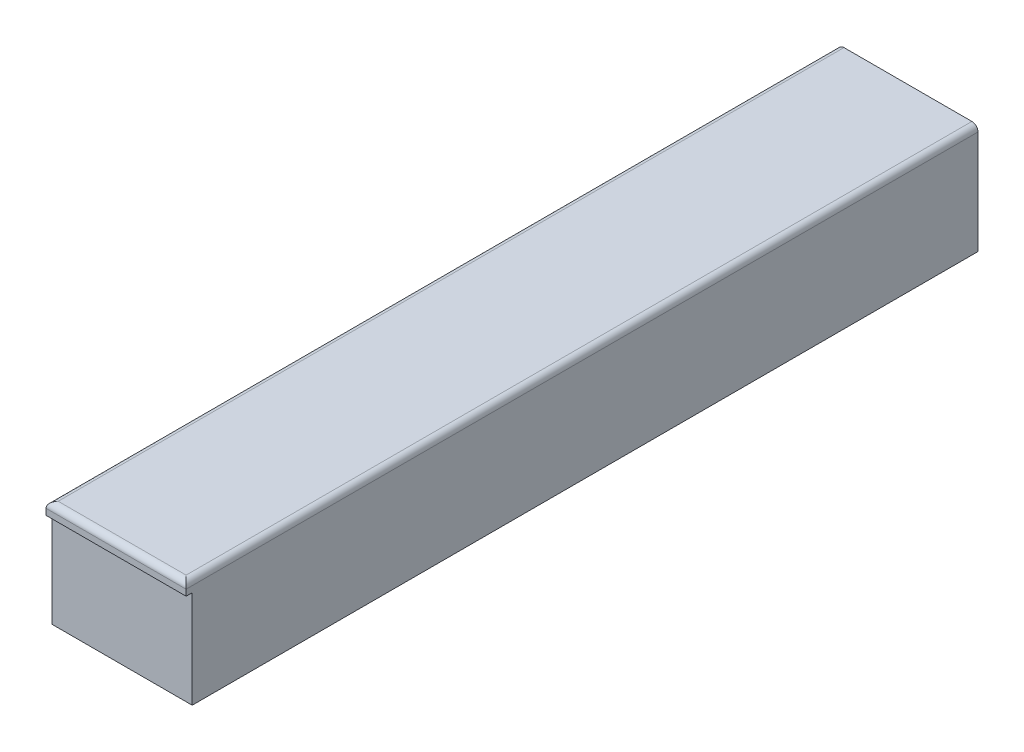
ISO-10303-21;
HEADER;
FILE_DESCRIPTION(('STEP AP214'),'2;1');
FILE_NAME('part.step','',(''),(''),'','','');
FILE_SCHEMA(('AUTOMOTIVE_DESIGN { 1 0 10303 214 1 1 1 1 }'));
ENDSEC;
DATA;
#1=APPLICATION_CONTEXT('core data for automotive mechanical design processes');
#2=APPLICATION_PROTOCOL_DEFINITION('international standard','automotive_design',2000,#1);
#3=PRODUCT_CONTEXT('',#1,'mechanical');
#4=PRODUCT('Part','Part','',(#3));
#5=PRODUCT_RELATED_PRODUCT_CATEGORY('part','',(#4));
#6=PRODUCT_DEFINITION_FORMATION('','',#4);
#7=PRODUCT_DEFINITION_CONTEXT('part definition',#1,'design');
#8=PRODUCT_DEFINITION('design','',#6,#7);
#9=PRODUCT_DEFINITION_SHAPE('','',#8);
#10=(LENGTH_UNIT() NAMED_UNIT(*) SI_UNIT(.MILLI.,.METRE.));
#11=(NAMED_UNIT(*) PLANE_ANGLE_UNIT() SI_UNIT($,.RADIAN.));
#12=(NAMED_UNIT(*) SI_UNIT($,.STERADIAN.) SOLID_ANGLE_UNIT());
#13=UNCERTAINTY_MEASURE_WITH_UNIT(LENGTH_MEASURE(1.E-05),#10,'distance_accuracy_value','');
#14=(GEOMETRIC_REPRESENTATION_CONTEXT(3) GLOBAL_UNCERTAINTY_ASSIGNED_CONTEXT((#13)) GLOBAL_UNIT_ASSIGNED_CONTEXT((#10,
#11,#12)) REPRESENTATION_CONTEXT('',''));
#15=CARTESIAN_POINT('',(0.,0.,0.));
#16=DIRECTION('',(0.,0.,1.));
#17=DIRECTION('',(1.,0.,0.));
#18=AXIS2_PLACEMENT_3D('',#15,#16,#17);
#19=CARTESIAN_POINT('',(0.,18.,0.));
#20=DIRECTION('',(0.,0.,-1.));
#21=DIRECTION('',(-1.,0.,0.));
#22=AXIS2_PLACEMENT_3D('',#19,#20,#21);
#23=PLANE('',#22);
#24=DIRECTION('',(0.,-1.,0.));
#25=VECTOR('',#24,1.);
#26=CARTESIAN_POINT('',(23.,18.,0.));
#27=LINE('',#26,#25);
#28=CARTESIAN_POINT('',(23.,17.,0.));
#29=VERTEX_POINT('',#28);
#30=CARTESIAN_POINT('',(23.,16.,0.));
#31=VERTEX_POINT('',#30);
#32=EDGE_CURVE('E142',#29,#31,#27,.T.);
#33=ORIENTED_EDGE('',*,*,#32,.F.);
#34=DIRECTION('',(1.,0.,0.));
#35=VECTOR('',#34,1.);
#36=CARTESIAN_POINT('',(0.,17.,0.));
#37=LINE('',#36,#35);
#38=CARTESIAN_POINT('',(0.,17.,0.));
#39=VERTEX_POINT('',#38);
#40=EDGE_CURVE('E11',#29,#39,#37,.F.);
#41=ORIENTED_EDGE('',*,*,#40,.T.);
#42=DIRECTION('',(0.,-1.,0.));
#43=VECTOR('',#42,1.);
#44=CARTESIAN_POINT('',(0.,18.,0.));
#45=LINE('',#44,#43);
#46=CARTESIAN_POINT('',(0.,16.,0.));
#47=VERTEX_POINT('',#46);
#48=EDGE_CURVE('E136',#39,#47,#45,.T.);
#49=ORIENTED_EDGE('',*,*,#48,.T.);
#50=DIRECTION('',(-1.,0.,0.));
#51=VECTOR('',#50,1.);
#52=CARTESIAN_POINT('',(0.,16.,0.));
#53=LINE('',#52,#51);
#54=EDGE_CURVE('E162',#31,#47,#53,.T.);
#55=ORIENTED_EDGE('',*,*,#54,.F.);
#56=EDGE_LOOP('',(#33,#41,#49,#55));
#57=FACE_BOUND('',#56,.T.);
#58=ADVANCED_FACE('F35',(#57),#23,.F.);
#59=CARTESIAN_POINT('',(23.,18.,0.));
#60=DIRECTION('',(-1.,0.,0.));
#61=DIRECTION('',(0.,0.,1.));
#62=AXIS2_PLACEMENT_3D('',#59,#60,#61);
#63=PLANE('',#62);
#64=DIRECTION('',(0.,-1.,0.));
#65=VECTOR('',#64,1.);
#66=CARTESIAN_POINT('',(23.,18.,-130.));
#67=LINE('',#66,#65);
#68=CARTESIAN_POINT('',(23.,17.,-130.));
#69=VERTEX_POINT('',#68);
#70=CARTESIAN_POINT('',(23.,0.,-130.));
#71=VERTEX_POINT('',#70);
#72=EDGE_CURVE('E140',#69,#71,#67,.T.);
#73=ORIENTED_EDGE('',*,*,#72,.F.);
#74=DIRECTION('',(0.,0.,-1.));
#75=VECTOR('',#74,1.);
#76=CARTESIAN_POINT('',(23.,17.,0.));
#77=LINE('',#76,#75);
#78=EDGE_CURVE('E58',#69,#29,#77,.F.);
#79=ORIENTED_EDGE('',*,*,#78,.T.);
#80=ORIENTED_EDGE('',*,*,#32,.T.);
#81=DIRECTION('',(0.,0.,1.));
#82=VECTOR('',#81,1.);
#83=CARTESIAN_POINT('',(23.,16.,-1.));
#84=LINE('',#83,#82);
#85=CARTESIAN_POINT('',(23.,16.,-1.));
#86=VERTEX_POINT('',#85);
#87=EDGE_CURVE('E119',#86,#31,#84,.T.);
#88=ORIENTED_EDGE('',*,*,#87,.F.);
#89=DIRECTION('',(0.,1.,0.));
#90=VECTOR('',#89,1.);
#91=CARTESIAN_POINT('',(23.,0.,-1.));
#92=LINE('',#91,#90);
#93=CARTESIAN_POINT('',(23.,0.,-1.));
#94=VERTEX_POINT('',#93);
#95=EDGE_CURVE('E104',#94,#86,#92,.T.);
#96=ORIENTED_EDGE('',*,*,#95,.F.);
#97=DIRECTION('',(0.,0.,-1.));
#98=VECTOR('',#97,1.);
#99=CARTESIAN_POINT('',(23.,0.,0.));
#100=LINE('',#99,#98);
#101=EDGE_CURVE('E116',#94,#71,#100,.T.);
#102=ORIENTED_EDGE('',*,*,#101,.T.);
#103=EDGE_LOOP('',(#73,#79,#80,#88,#96,#102));
#104=FACE_BOUND('',#103,.T.);
#105=ADVANCED_FACE('F115',(#104),#63,.F.);
#106=CARTESIAN_POINT('',(0.,18.,-130.));
#107=DIRECTION('',(0.,0.,-1.));
#108=DIRECTION('',(-1.,0.,0.));
#109=AXIS2_PLACEMENT_3D('',#106,#107,#108);
#110=PLANE('',#109);
#111=DIRECTION('',(1.,0.,0.));
#112=VECTOR('',#111,1.);
#113=CARTESIAN_POINT('',(0.,18.,-130.));
#114=LINE('',#113,#112);
#115=CARTESIAN_POINT('',(0.999999999999976,18.,-130.));
#116=VERTEX_POINT('',#115);
#117=CARTESIAN_POINT('',(22.,18.,-130.));
#118=VERTEX_POINT('',#117);
#119=EDGE_CURVE('E132',#116,#118,#114,.T.);
#120=ORIENTED_EDGE('',*,*,#119,.T.);
#121=CARTESIAN_POINT('',(22.,17.,-130.));
#122=DIRECTION('',(0.,0.,-1.));
#123=DIRECTION('',(-1.,0.,0.));
#124=AXIS2_PLACEMENT_3D('',#121,#122,#123);
#125=CIRCLE('',#124,1.);
#126=EDGE_CURVE('E153',#118,#69,#125,.T.);
#127=ORIENTED_EDGE('',*,*,#126,.T.);
#128=ORIENTED_EDGE('',*,*,#72,.T.);
#129=DIRECTION('',(1.,0.,0.));
#130=VECTOR('',#129,1.);
#131=CARTESIAN_POINT('',(0.,0.,-130.));
#132=LINE('',#131,#130);
#133=CARTESIAN_POINT('',(0.,0.,-130.));
#134=VERTEX_POINT('',#133);
#135=EDGE_CURVE('E124',#134,#71,#132,.T.);
#136=ORIENTED_EDGE('',*,*,#135,.F.);
#137=DIRECTION('',(0.,-1.,0.));
#138=VECTOR('',#137,1.);
#139=CARTESIAN_POINT('',(0.,18.,-130.));
#140=LINE('',#139,#138);
#141=CARTESIAN_POINT('',(0.,17.,-130.));
#142=VERTEX_POINT('',#141);
#143=EDGE_CURVE('E138',#142,#134,#140,.T.);
#144=ORIENTED_EDGE('',*,*,#143,.F.);
#145=CARTESIAN_POINT('',(0.999999999999976,17.,-130.));
#146=DIRECTION('',(0.,0.,-1.));
#147=DIRECTION('',(-1.,0.,0.));
#148=AXIS2_PLACEMENT_3D('',#145,#146,#147);
#149=CIRCLE('',#148,1.);
#150=EDGE_CURVE('E151',#142,#116,#149,.T.);
#151=ORIENTED_EDGE('',*,*,#150,.T.);
#152=EDGE_LOOP('',(#120,#127,#128,#136,#144,#151));
#153=FACE_BOUND('',#152,.T.);
#154=ADVANCED_FACE('F177',(#153),#110,.T.);
#155=CARTESIAN_POINT('',(0.,18.,0.));
#156=DIRECTION('',(-1.,0.,0.));
#157=DIRECTION('',(0.,0.,1.));
#158=AXIS2_PLACEMENT_3D('',#155,#156,#157);
#159=PLANE('',#158);
#160=ORIENTED_EDGE('',*,*,#48,.F.);
#161=DIRECTION('',(0.,0.,-1.));
#162=VECTOR('',#161,1.);
#163=CARTESIAN_POINT('',(0.,17.,0.));
#164=LINE('',#163,#162);
#165=EDGE_CURVE('E44',#39,#142,#164,.T.);
#166=ORIENTED_EDGE('',*,*,#165,.T.);
#167=ORIENTED_EDGE('',*,*,#143,.T.);
#168=DIRECTION('',(0.,0.,-1.));
#169=VECTOR('',#168,1.);
#170=CARTESIAN_POINT('',(0.,0.,0.));
#171=LINE('',#170,#169);
#172=CARTESIAN_POINT('',(0.,0.,-1.));
#173=VERTEX_POINT('',#172);
#174=EDGE_CURVE('E127',#173,#134,#171,.T.);
#175=ORIENTED_EDGE('',*,*,#174,.F.);
#176=DIRECTION('',(0.,-1.,0.));
#177=VECTOR('',#176,1.);
#178=CARTESIAN_POINT('',(0.,0.,-1.));
#179=LINE('',#178,#177);
#180=CARTESIAN_POINT('',(0.,16.,-1.));
#181=VERTEX_POINT('',#180);
#182=EDGE_CURVE('E107',#181,#173,#179,.T.);
#183=ORIENTED_EDGE('',*,*,#182,.F.);
#184=DIRECTION('',(0.,0.,1.));
#185=VECTOR('',#184,1.);
#186=CARTESIAN_POINT('',(0.,16.,-1.));
#187=LINE('',#186,#185);
#188=EDGE_CURVE('E125',#181,#47,#187,.T.);
#189=ORIENTED_EDGE('',*,*,#188,.T.);
#190=EDGE_LOOP('',(#160,#166,#167,#175,#183,#189));
#191=FACE_BOUND('',#190,.T.);
#192=ADVANCED_FACE('F173',(#191),#159,.T.);
#193=CARTESIAN_POINT('',(0.,18.,0.));
#194=DIRECTION('',(0.,1.,0.));
#195=DIRECTION('',(0.,0.,1.));
#196=AXIS2_PLACEMENT_3D('',#193,#194,#195);
#197=PLANE('',#196);
#198=DIRECTION('',(1.,0.,0.));
#199=VECTOR('',#198,1.);
#200=CARTESIAN_POINT('',(23.,18.,-1.));
#201=LINE('',#200,#199);
#202=CARTESIAN_POINT('',(1.,18.,-1.));
#203=VERTEX_POINT('',#202);
#204=CARTESIAN_POINT('',(22.,18.,-1.));
#205=VERTEX_POINT('',#204);
#206=EDGE_CURVE('E144',#203,#205,#201,.T.);
#207=ORIENTED_EDGE('',*,*,#206,.T.);
#208=DIRECTION('',(0.,0.,-1.));
#209=VECTOR('',#208,1.);
#210=CARTESIAN_POINT('',(22.,18.,-130.));
#211=LINE('',#210,#209);
#212=EDGE_CURVE('E148',#205,#118,#211,.T.);
#213=ORIENTED_EDGE('',*,*,#212,.T.);
#214=ORIENTED_EDGE('',*,*,#119,.F.);
#215=DIRECTION('',(0.,0.,-1.));
#216=VECTOR('',#215,1.);
#217=CARTESIAN_POINT('',(1.,18.,0.));
#218=LINE('',#217,#216);
#219=EDGE_CURVE('E146',#116,#203,#218,.F.);
#220=ORIENTED_EDGE('',*,*,#219,.T.);
#221=EDGE_LOOP('',(#207,#213,#214,#220));
#222=FACE_BOUND('',#221,.T.);
#223=ADVANCED_FACE('F182',(#222),#197,.T.);
#224=CARTESIAN_POINT('',(0.,0.,0.));
#225=DIRECTION('',(0.,1.,0.));
#226=DIRECTION('',(0.,0.,1.));
#227=AXIS2_PLACEMENT_3D('',#224,#225,#226);
#228=PLANE('',#227);
#229=ORIENTED_EDGE('',*,*,#101,.F.);
#230=DIRECTION('',(1.,0.,0.));
#231=VECTOR('',#230,1.);
#232=CARTESIAN_POINT('',(0.,0.,-1.));
#233=LINE('',#232,#231);
#234=EDGE_CURVE('E100',#173,#94,#233,.T.);
#235=ORIENTED_EDGE('',*,*,#234,.F.);
#236=ORIENTED_EDGE('',*,*,#174,.T.);
#237=ORIENTED_EDGE('',*,*,#135,.T.);
#238=EDGE_LOOP('',(#229,#235,#236,#237));
#239=FACE_BOUND('',#238,.T.);
#240=ADVANCED_FACE('F122',(#239),#228,.F.);
#241=CARTESIAN_POINT('',(0.,16.,-1.));
#242=DIRECTION('',(0.,1.,0.));
#243=DIRECTION('',(0.,0.,1.));
#244=AXIS2_PLACEMENT_3D('',#241,#242,#243);
#245=PLANE('',#244);
#246=ORIENTED_EDGE('',*,*,#54,.T.);
#247=ORIENTED_EDGE('',*,*,#188,.F.);
#248=DIRECTION('',(-1.,0.,0.));
#249=VECTOR('',#248,1.);
#250=CARTESIAN_POINT('',(0.,16.,-1.));
#251=LINE('',#250,#249);
#252=EDGE_CURVE('E120',#86,#181,#251,.T.);
#253=ORIENTED_EDGE('',*,*,#252,.F.);
#254=ORIENTED_EDGE('',*,*,#87,.T.);
#255=EDGE_LOOP('',(#246,#247,#253,#254));
#256=FACE_BOUND('',#255,.T.);
#257=ADVANCED_FACE('F206',(#256),#245,.F.);
#258=CARTESIAN_POINT('',(0.,0.,-1.));
#259=DIRECTION('',(0.,0.,-1.));
#260=DIRECTION('',(-1.,0.,0.));
#261=AXIS2_PLACEMENT_3D('',#258,#259,#260);
#262=PLANE('',#261);
#263=ORIENTED_EDGE('',*,*,#182,.T.);
#264=ORIENTED_EDGE('',*,*,#234,.T.);
#265=ORIENTED_EDGE('',*,*,#95,.T.);
#266=ORIENTED_EDGE('',*,*,#252,.T.);
#267=EDGE_LOOP('',(#263,#264,#265,#266));
#268=FACE_BOUND('',#267,.T.);
#269=ADVANCED_FACE('F102',(#268),#262,.F.);
#270=CARTESIAN_POINT('',(1.,17.,0.));
#271=DIRECTION('',(0.,0.,-1.));
#272=DIRECTION('',(-1.,0.,0.));
#273=AXIS2_PLACEMENT_3D('',#270,#271,#272);
#274=CYLINDRICAL_SURFACE('',#273,1.);
#275=ORIENTED_EDGE('',*,*,#150,.F.);
#276=ORIENTED_EDGE('',*,*,#165,.F.);
#277=CARTESIAN_POINT('',(1.,17.,-1.));
#278=DIRECTION('',(-0.707106781186548,0.,-0.707106781186547));
#279=DIRECTION('',(-0.707106781186547,0.,0.707106781186548));
#280=AXIS2_PLACEMENT_3D('',#277,#278,#279);
#281=ELLIPSE('',#280,1.41421356237309,1.);
#282=EDGE_CURVE('E39',#203,#39,#281,.F.);
#283=ORIENTED_EDGE('',*,*,#282,.F.);
#284=ORIENTED_EDGE('',*,*,#219,.F.);
#285=EDGE_LOOP('',(#275,#276,#283,#284));
#286=FACE_BOUND('',#285,.T.);
#287=ADVANCED_FACE('F37',(#286),#274,.T.);
#288=CARTESIAN_POINT('',(0.,17.,-1.));
#289=DIRECTION('',(-1.,0.,0.));
#290=DIRECTION('',(0.,0.,1.));
#291=AXIS2_PLACEMENT_3D('',#288,#289,#290);
#292=CYLINDRICAL_SURFACE('',#291,1.);
#293=ORIENTED_EDGE('',*,*,#282,.T.);
#294=ORIENTED_EDGE('',*,*,#40,.F.);
#295=CARTESIAN_POINT('',(22.,17.,-1.));
#296=DIRECTION('',(-0.707106781186547,0.,0.707106781186548));
#297=DIRECTION('',(-0.707106781186548,0.,-0.707106781186547));
#298=AXIS2_PLACEMENT_3D('',#295,#296,#297);
#299=ELLIPSE('',#298,1.4142135623731,1.);
#300=EDGE_CURVE('E156',#205,#29,#299,.F.);
#301=ORIENTED_EDGE('',*,*,#300,.F.);
#302=ORIENTED_EDGE('',*,*,#206,.F.);
#303=EDGE_LOOP('',(#293,#294,#301,#302));
#304=FACE_BOUND('',#303,.T.);
#305=ADVANCED_FACE('F186',(#304),#292,.T.);
#306=CARTESIAN_POINT('',(22.,17.,0.));
#307=DIRECTION('',(0.,0.,1.));
#308=DIRECTION('',(1.,0.,0.));
#309=AXIS2_PLACEMENT_3D('',#306,#307,#308);
#310=CYLINDRICAL_SURFACE('',#309,1.);
#311=ORIENTED_EDGE('',*,*,#300,.T.);
#312=ORIENTED_EDGE('',*,*,#78,.F.);
#313=ORIENTED_EDGE('',*,*,#126,.F.);
#314=ORIENTED_EDGE('',*,*,#212,.F.);
#315=EDGE_LOOP('',(#311,#312,#313,#314));
#316=FACE_BOUND('',#315,.T.);
#317=ADVANCED_FACE('F179',(#316),#310,.T.);
#318=CLOSED_SHELL('',(#58,#105,#154,#192,#223,#240,#257,#269,#287,#305,#317));
#319=MANIFOLD_SOLID_BREP('B2',#318);
#320=ADVANCED_BREP_SHAPE_REPRESENTATION('',(#18,#319),#14);
#321=SHAPE_DEFINITION_REPRESENTATION(#9,#320);
ENDSEC;
END-ISO-10303-21;
